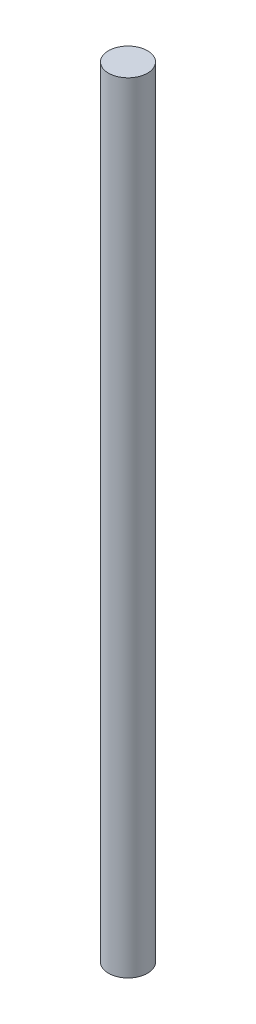
ISO-10303-21;
HEADER;
FILE_DESCRIPTION(('STEP AP214'),'2;1');
FILE_NAME('part.step','',(''),(''),'','','');
FILE_SCHEMA(('AUTOMOTIVE_DESIGN { 1 0 10303 214 1 1 1 1 }'));
ENDSEC;
DATA;
#1=APPLICATION_CONTEXT('core data for automotive mechanical design processes');
#2=APPLICATION_PROTOCOL_DEFINITION('international standard','automotive_design',2000,#1);
#3=PRODUCT_CONTEXT('',#1,'mechanical');
#4=PRODUCT('Part','Part','',(#3));
#5=PRODUCT_RELATED_PRODUCT_CATEGORY('part','',(#4));
#6=PRODUCT_DEFINITION_FORMATION('','',#4);
#7=PRODUCT_DEFINITION_CONTEXT('part definition',#1,'design');
#8=PRODUCT_DEFINITION('design','',#6,#7);
#9=PRODUCT_DEFINITION_SHAPE('','',#8);
#10=(LENGTH_UNIT() NAMED_UNIT(*) SI_UNIT(.MILLI.,.METRE.));
#11=(NAMED_UNIT(*) PLANE_ANGLE_UNIT() SI_UNIT($,.RADIAN.));
#12=(NAMED_UNIT(*) SI_UNIT($,.STERADIAN.) SOLID_ANGLE_UNIT());
#13=UNCERTAINTY_MEASURE_WITH_UNIT(LENGTH_MEASURE(1.E-05),#10,'distance_accuracy_value','');
#14=(GEOMETRIC_REPRESENTATION_CONTEXT(3) GLOBAL_UNCERTAINTY_ASSIGNED_CONTEXT((#13)) GLOBAL_UNIT_ASSIGNED_CONTEXT((#10,
#11,#12)) REPRESENTATION_CONTEXT('',''));
#15=CARTESIAN_POINT('',(0.,0.,0.));
#16=DIRECTION('',(0.,0.,1.));
#17=DIRECTION('',(1.,0.,0.));
#18=AXIS2_PLACEMENT_3D('',#15,#16,#17);
#19=CARTESIAN_POINT('',(0.,25.4,0.));
#20=DIRECTION('',(0.,-1.,0.));
#21=DIRECTION('',(0.,0.,-1.));
#22=AXIS2_PLACEMENT_3D('',#19,#20,#21);
#23=CYLINDRICAL_SURFACE('',#22,1.27);
#24=CARTESIAN_POINT('',(0.,25.4,0.));
#25=DIRECTION('',(0.,1.,0.));
#26=DIRECTION('',(0.,0.,1.));
#27=AXIS2_PLACEMENT_3D('',#24,#25,#26);
#28=CIRCLE('',#27,1.27);
#29=CARTESIAN_POINT('',(0.,25.4,1.27));
#30=VERTEX_POINT('',#29);
#31=EDGE_CURVE('E10',#30,#30,#28,.T.);
#32=ORIENTED_EDGE('',*,*,#31,.F.);
#33=EDGE_LOOP('',(#32));
#34=FACE_BOUND('',#33,.T.);
#35=CARTESIAN_POINT('',(0.,-25.4,0.));
#36=DIRECTION('',(0.,1.,0.));
#37=DIRECTION('',(0.,0.,1.));
#38=AXIS2_PLACEMENT_3D('',#35,#36,#37);
#39=CIRCLE('',#38,1.27);
#40=CARTESIAN_POINT('',(0.,-25.4,1.27));
#41=VERTEX_POINT('',#40);
#42=EDGE_CURVE('E34',#41,#41,#39,.T.);
#43=ORIENTED_EDGE('',*,*,#42,.T.);
#44=EDGE_LOOP('',(#43));
#45=FACE_BOUND('',#44,.T.);
#46=ADVANCED_FACE('F31',(#34,#45),#23,.T.);
#47=CARTESIAN_POINT('',(0.,25.4,0.));
#48=DIRECTION('',(0.,1.,0.));
#49=DIRECTION('',(0.,0.,1.));
#50=AXIS2_PLACEMENT_3D('',#47,#48,#49);
#51=PLANE('',#50);
#52=ORIENTED_EDGE('',*,*,#31,.T.);
#53=EDGE_LOOP('',(#52));
#54=FACE_BOUND('',#53,.T.);
#55=ADVANCED_FACE('F46',(#54),#51,.T.);
#56=CARTESIAN_POINT('',(0.,-25.4,0.));
#57=DIRECTION('',(0.,1.,0.));
#58=DIRECTION('',(0.,0.,1.));
#59=AXIS2_PLACEMENT_3D('',#56,#57,#58);
#60=PLANE('',#59);
#61=ORIENTED_EDGE('',*,*,#42,.F.);
#62=EDGE_LOOP('',(#61));
#63=FACE_BOUND('',#62,.T.);
#64=ADVANCED_FACE('F44',(#63),#60,.F.);
#65=CLOSED_SHELL('',(#46,#55,#64));
#66=MANIFOLD_SOLID_BREP('B2',#65);
#67=ADVANCED_BREP_SHAPE_REPRESENTATION('',(#18,#66),#14);
#68=SHAPE_DEFINITION_REPRESENTATION(#9,#67);
ENDSEC;
END-ISO-10303-21;
